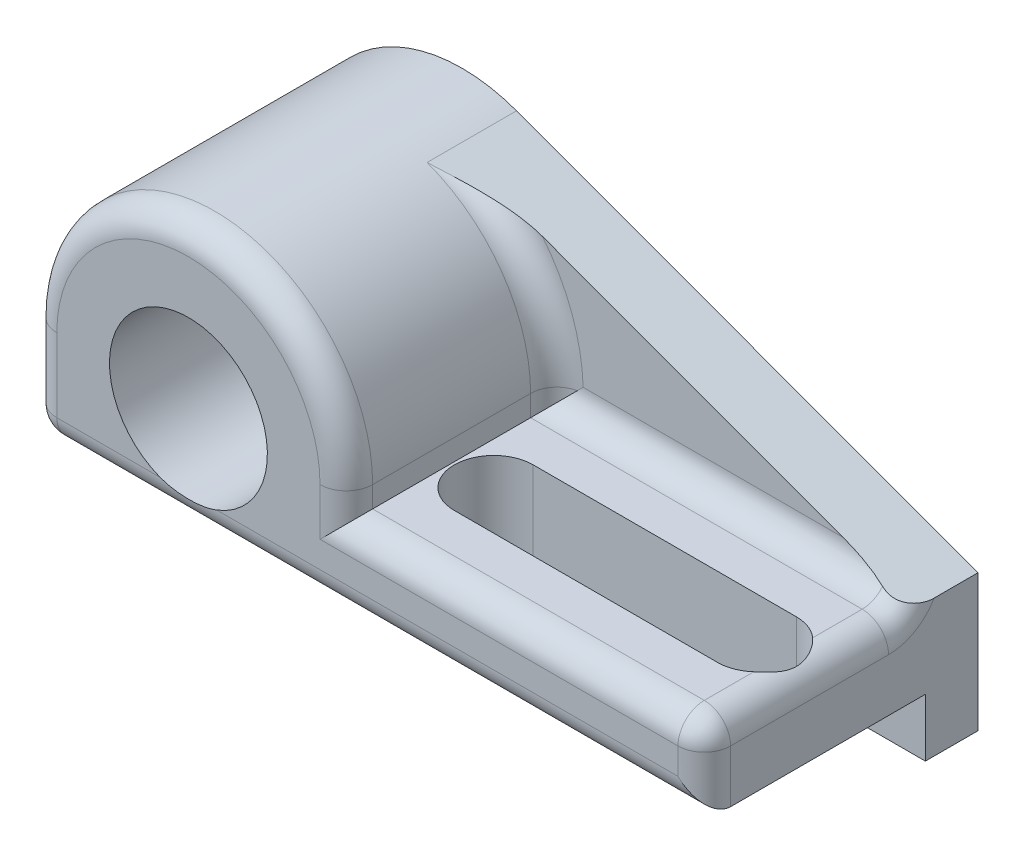
ISO-10303-21;
HEADER;
FILE_DESCRIPTION(('STEP AP214'),'2;1');
FILE_NAME('part.step','',(''),(''),'','','');
FILE_SCHEMA(('AUTOMOTIVE_DESIGN { 1 0 10303 214 1 1 1 1 }'));
ENDSEC;
DATA;
#1=APPLICATION_CONTEXT('core data for automotive mechanical design processes');
#2=APPLICATION_PROTOCOL_DEFINITION('international standard','automotive_design',2000,#1);
#3=PRODUCT_CONTEXT('',#1,'mechanical');
#4=PRODUCT('Part','Part','',(#3));
#5=PRODUCT_RELATED_PRODUCT_CATEGORY('part','',(#4));
#6=PRODUCT_DEFINITION_FORMATION('','',#4);
#7=PRODUCT_DEFINITION_CONTEXT('part definition',#1,'design');
#8=PRODUCT_DEFINITION('design','',#6,#7);
#9=PRODUCT_DEFINITION_SHAPE('','',#8);
#10=(LENGTH_UNIT() NAMED_UNIT(*) SI_UNIT(.MILLI.,.METRE.));
#11=(NAMED_UNIT(*) PLANE_ANGLE_UNIT() SI_UNIT($,.RADIAN.));
#12=(NAMED_UNIT(*) SI_UNIT($,.STERADIAN.) SOLID_ANGLE_UNIT());
#13=UNCERTAINTY_MEASURE_WITH_UNIT(LENGTH_MEASURE(1.E-05),#10,'distance_accuracy_value','');
#14=(GEOMETRIC_REPRESENTATION_CONTEXT(3) GLOBAL_UNCERTAINTY_ASSIGNED_CONTEXT((#13)) GLOBAL_UNIT_ASSIGNED_CONTEXT((#10,
#11,#12)) REPRESENTATION_CONTEXT('',''));
#15=CARTESIAN_POINT('',(0.,0.,0.));
#16=DIRECTION('',(0.,0.,1.));
#17=DIRECTION('',(1.,0.,0.));
#18=AXIS2_PLACEMENT_3D('',#15,#16,#17);
#19=CARTESIAN_POINT('',(-64.,0.,52.));
#20=DIRECTION('',(-1.,0.,0.));
#21=DIRECTION('',(0.,0.,1.));
#22=AXIS2_PLACEMENT_3D('',#19,#20,#21);
#23=PLANE('',#22);
#24=DIRECTION('',(0.,-1.,0.));
#25=VECTOR('',#24,1.);
#26=CARTESIAN_POINT('',(-64.,0.,10.));
#27=LINE('',#26,#25);
#28=CARTESIAN_POINT('',(-64.,16.,10.));
#29=VERTEX_POINT('',#28);
#30=CARTESIAN_POINT('',(-64.,0.,10.));
#31=VERTEX_POINT('',#30);
#32=EDGE_CURVE('E255',#29,#31,#27,.T.);
#33=ORIENTED_EDGE('',*,*,#32,.F.);
#34=DIRECTION('',(0.,0.,-1.));
#35=VECTOR('',#34,1.);
#36=CARTESIAN_POINT('',(-64.,16.,52.));
#37=LINE('',#36,#35);
#38=CARTESIAN_POINT('',(-64.,16.,47.));
#39=VERTEX_POINT('',#38);
#40=EDGE_CURVE('E536',#29,#39,#37,.F.);
#41=ORIENTED_EDGE('',*,*,#40,.T.);
#42=DIRECTION('',(0.,1.,0.));
#43=VECTOR('',#42,1.);
#44=CARTESIAN_POINT('',(-64.,0.,47.));
#45=LINE('',#44,#43);
#46=CARTESIAN_POINT('',(-64.,30.,47.));
#47=VERTEX_POINT('',#46);
#48=EDGE_CURVE('E395',#39,#47,#45,.T.);
#49=ORIENTED_EDGE('',*,*,#48,.T.);
#50=DIRECTION('',(0.,0.,-1.));
#51=VECTOR('',#50,1.);
#52=CARTESIAN_POINT('',(-64.,30.,52.));
#53=LINE('',#52,#51);
#54=CARTESIAN_POINT('',(-64.,30.,0.));
#55=VERTEX_POINT('',#54);
#56=EDGE_CURVE('E322',#47,#55,#53,.T.);
#57=ORIENTED_EDGE('',*,*,#56,.T.);
#58=DIRECTION('',(0.,1.,0.));
#59=VECTOR('',#58,1.);
#60=CARTESIAN_POINT('',(-64.,0.,0.));
#61=LINE('',#60,#59);
#62=CARTESIAN_POINT('',(-64.,0.,0.));
#63=VERTEX_POINT('',#62);
#64=EDGE_CURVE('E299',#63,#55,#61,.T.);
#65=ORIENTED_EDGE('',*,*,#64,.F.);
#66=DIRECTION('',(0.,0.,-1.));
#67=VECTOR('',#66,1.);
#68=CARTESIAN_POINT('',(-64.,0.,52.));
#69=LINE('',#68,#67);
#70=EDGE_CURVE('E319',#31,#63,#69,.T.);
#71=ORIENTED_EDGE('',*,*,#70,.F.);
#72=EDGE_LOOP('',(#33,#41,#49,#57,#65,#71));
#73=FACE_BOUND('',#72,.T.);
#74=ADVANCED_FACE('F49',(#73),#23,.T.);
#75=CARTESIAN_POINT('',(0.,0.,52.));
#76=DIRECTION('',(0.,-1.,0.));
#77=DIRECTION('',(1.,0.,0.));
#78=AXIS2_PLACEMENT_3D('',#75,#76,#77);
#79=PLANE('',#78);
#80=DIRECTION('',(0.,0.,-1.));
#81=VECTOR('',#80,1.);
#82=CARTESIAN_POINT('',(64.,0.,52.));
#83=LINE('',#82,#81);
#84=CARTESIAN_POINT('',(64.,0.,10.));
#85=VERTEX_POINT('',#84);
#86=CARTESIAN_POINT('',(64.,0.,0.));
#87=VERTEX_POINT('',#86);
#88=EDGE_CURVE('E316',#85,#87,#83,.T.);
#89=ORIENTED_EDGE('',*,*,#88,.F.);
#90=DIRECTION('',(1.,0.,0.));
#91=VECTOR('',#90,1.);
#92=CARTESIAN_POINT('',(-64.,0.,10.));
#93=LINE('',#92,#91);
#94=EDGE_CURVE('E266',#31,#85,#93,.T.);
#95=ORIENTED_EDGE('',*,*,#94,.F.);
#96=ORIENTED_EDGE('',*,*,#70,.T.);
#97=DIRECTION('',(-1.,0.,0.));
#98=VECTOR('',#97,1.);
#99=CARTESIAN_POINT('',(0.,0.,0.));
#100=LINE('',#99,#98);
#101=EDGE_CURVE('E303',#87,#63,#100,.T.);
#102=ORIENTED_EDGE('',*,*,#101,.F.);
#103=EDGE_LOOP('',(#89,#95,#96,#102));
#104=FACE_BOUND('',#103,.T.);
#105=ADVANCED_FACE('F479',(#104),#79,.T.);
#106=CARTESIAN_POINT('',(64.,0.,52.));
#107=DIRECTION('',(1.,0.,0.));
#108=DIRECTION('',(0.,0.,-1.));
#109=AXIS2_PLACEMENT_3D('',#106,#107,#108);
#110=PLANE('',#109);
#111=DIRECTION('',(0.,0.,-1.));
#112=VECTOR('',#111,1.);
#113=CARTESIAN_POINT('',(64.,26.,12.));
#114=LINE('',#113,#112);
#115=CARTESIAN_POINT('',(64.,26.,8.33974596215561));
#116=VERTEX_POINT('',#115);
#117=CARTESIAN_POINT('',(64.,26.,0.));
#118=VERTEX_POINT('',#117);
#119=EDGE_CURVE('E276',#116,#118,#114,.T.);
#120=ORIENTED_EDGE('',*,*,#119,.F.);
#121=CARTESIAN_POINT('',(64.,31.,17.));
#122=DIRECTION('',(1.,0.,0.));
#123=DIRECTION('',(0.,0.,-1.));
#124=AXIS2_PLACEMENT_3D('',#121,#122,#123);
#125=CIRCLE('',#124,10.);
#126=CARTESIAN_POINT('',(64.,21.,17.));
#127=VERTEX_POINT('',#126);
#128=EDGE_CURVE('E578',#116,#127,#125,.F.);
#129=ORIENTED_EDGE('',*,*,#128,.T.);
#130=DIRECTION('',(0.,0.,-1.));
#131=VECTOR('',#130,1.);
#132=CARTESIAN_POINT('',(64.,21.,52.));
#133=LINE('',#132,#131);
#134=CARTESIAN_POINT('',(64.,21.,47.));
#135=VERTEX_POINT('',#134);
#136=EDGE_CURVE('E584',#127,#135,#133,.F.);
#137=ORIENTED_EDGE('',*,*,#136,.T.);
#138=DIRECTION('',(0.,-1.,0.));
#139=VECTOR('',#138,1.);
#140=CARTESIAN_POINT('',(64.,0.,47.));
#141=LINE('',#140,#139);
#142=CARTESIAN_POINT('',(64.,11.,47.));
#143=VERTEX_POINT('',#142);
#144=EDGE_CURVE('E565',#135,#143,#141,.T.);
#145=ORIENTED_EDGE('',*,*,#144,.T.);
#146=DIRECTION('',(0.,0.,-1.));
#147=VECTOR('',#146,1.);
#148=CARTESIAN_POINT('',(64.,11.,0.));
#149=LINE('',#148,#147);
#150=CARTESIAN_POINT('',(64.,11.,10.));
#151=VERTEX_POINT('',#150);
#152=EDGE_CURVE('E259',#143,#151,#149,.T.);
#153=ORIENTED_EDGE('',*,*,#152,.T.);
#154=DIRECTION('',(0.,-1.,0.));
#155=VECTOR('',#154,1.);
#156=CARTESIAN_POINT('',(64.,0.,10.));
#157=LINE('',#156,#155);
#158=EDGE_CURVE('E250',#151,#85,#157,.T.);
#159=ORIENTED_EDGE('',*,*,#158,.T.);
#160=ORIENTED_EDGE('',*,*,#88,.T.);
#161=DIRECTION('',(0.,-1.,0.));
#162=VECTOR('',#161,1.);
#163=CARTESIAN_POINT('',(64.,0.,0.));
#164=LINE('',#163,#162);
#165=EDGE_CURVE('E291',#118,#87,#164,.T.);
#166=ORIENTED_EDGE('',*,*,#165,.F.);
#167=EDGE_LOOP('',(#120,#129,#137,#145,#153,#159,#160,#166));
#168=FACE_BOUND('',#167,.T.);
#169=ADVANCED_FACE('F485',(#168),#110,.T.);
#170=CARTESIAN_POINT('',(0.,0.,52.));
#171=DIRECTION('',(0.,0.,1.));
#172=DIRECTION('',(1.,0.,0.));
#173=AXIS2_PLACEMENT_3D('',#170,#171,#172);
#174=PLANE('',#173);
#175=DIRECTION('',(0.,1.,0.));
#176=VECTOR('',#175,1.);
#177=CARTESIAN_POINT('',(-59.,0.,52.));
#178=LINE('',#177,#176);
#179=CARTESIAN_POINT('',(-59.,30.,52.));
#180=VERTEX_POINT('',#179);
#181=CARTESIAN_POINT('',(-59.,16.,52.));
#182=VERTEX_POINT('',#181);
#183=EDGE_CURVE('E404',#180,#182,#178,.F.);
#184=ORIENTED_EDGE('',*,*,#183,.T.);
#185=DIRECTION('',(1.,0.,0.));
#186=VECTOR('',#185,1.);
#187=CARTESIAN_POINT('',(0.,16.,52.));
#188=LINE('',#187,#186);
#189=CARTESIAN_POINT('',(-39.3851648071345,16.,52.));
#190=VERTEX_POINT('',#189);
#191=EDGE_CURVE('E506',#182,#190,#188,.T.);
#192=ORIENTED_EDGE('',*,*,#191,.T.);
#193=CARTESIAN_POINT('',(-34.,30.,52.));
#194=DIRECTION('',(0.,0.,1.));
#195=DIRECTION('',(1.,0.,0.));
#196=AXIS2_PLACEMENT_3D('',#193,#194,#195);
#197=CIRCLE('',#196,15.);
#198=CARTESIAN_POINT('',(-28.6148351928655,16.,52.));
#199=VERTEX_POINT('',#198);
#200=EDGE_CURVE('E287',#199,#190,#197,.T.);
#201=ORIENTED_EDGE('',*,*,#200,.F.);
#202=DIRECTION('',(1.,0.,0.));
#203=VECTOR('',#202,1.);
#204=CARTESIAN_POINT('',(0.,16.,52.));
#205=LINE('',#204,#203);
#206=CARTESIAN_POINT('',(59.,16.,52.));
#207=VERTEX_POINT('',#206);
#208=EDGE_CURVE('E67',#199,#207,#205,.T.);
#209=ORIENTED_EDGE('',*,*,#208,.T.);
#210=DIRECTION('',(0.,-1.,0.));
#211=VECTOR('',#210,1.);
#212=CARTESIAN_POINT('',(59.,0.,52.));
#213=LINE('',#212,#211);
#214=CARTESIAN_POINT('',(59.,21.,52.));
#215=VERTEX_POINT('',#214);
#216=EDGE_CURVE('E541',#207,#215,#213,.F.);
#217=ORIENTED_EDGE('',*,*,#216,.T.);
#218=DIRECTION('',(1.,0.,0.));
#219=VECTOR('',#218,1.);
#220=CARTESIAN_POINT('',(0.,21.,52.));
#221=LINE('',#220,#219);
#222=CARTESIAN_POINT('',(-9.,21.,52.));
#223=VERTEX_POINT('',#222);
#224=EDGE_CURVE('E408',#215,#223,#221,.F.);
#225=ORIENTED_EDGE('',*,*,#224,.T.);
#226=DIRECTION('',(0.,-1.,0.));
#227=VECTOR('',#226,1.);
#228=CARTESIAN_POINT('',(-9.,0.,52.));
#229=LINE('',#228,#227);
#230=CARTESIAN_POINT('',(-9.,30.,52.));
#231=VERTEX_POINT('',#230);
#232=EDGE_CURVE('E401',#223,#231,#229,.F.);
#233=ORIENTED_EDGE('',*,*,#232,.T.);
#234=CARTESIAN_POINT('',(-34.,30.,52.));
#235=DIRECTION('',(0.,0.,1.));
#236=DIRECTION('',(1.,0.,0.));
#237=AXIS2_PLACEMENT_3D('',#234,#235,#236);
#238=CIRCLE('',#237,25.);
#239=EDGE_CURVE('E398',#231,#180,#238,.T.);
#240=ORIENTED_EDGE('',*,*,#239,.T.);
#241=EDGE_LOOP('',(#184,#192,#201,#209,#217,#225,#233,#240));
#242=FACE_BOUND('',#241,.T.);
#243=ADVANCED_FACE('F492',(#242),#174,.T.);
#244=CARTESIAN_POINT('',(-34.,30.,52.));
#245=DIRECTION('',(0.,0.,-1.));
#246=DIRECTION('',(-1.,0.,0.));
#247=AXIS2_PLACEMENT_3D('',#244,#245,#246);
#248=CYLINDRICAL_SURFACE('',#247,30.);
#249=ORIENTED_EDGE('',*,*,#56,.F.);
#250=CARTESIAN_POINT('',(-34.,30.,47.));
#251=DIRECTION('',(0.,0.,1.));
#252=DIRECTION('',(1.,0.,0.));
#253=AXIS2_PLACEMENT_3D('',#250,#251,#252);
#254=CIRCLE('',#253,30.);
#255=CARTESIAN_POINT('',(-4.,30.,47.));
#256=VERTEX_POINT('',#255);
#257=EDGE_CURVE('E417',#47,#256,#254,.F.);
#258=ORIENTED_EDGE('',*,*,#257,.T.);
#259=DIRECTION('',(0.,0.,-1.));
#260=VECTOR('',#259,1.);
#261=CARTESIAN_POINT('',(-4.,30.,52.));
#262=LINE('',#261,#260);
#263=CARTESIAN_POINT('',(-4.,30.,17.));
#264=VERTEX_POINT('',#263);
#265=EDGE_CURVE('E290',#256,#264,#262,.T.);
#266=ORIENTED_EDGE('',*,*,#265,.T.);
#267=CARTESIAN_POINT('',(-34.,30.,17.));
#268=DIRECTION('',(0.,0.,1.));
#269=DIRECTION('',(1.,0.,0.));
#270=AXIS2_PLACEMENT_3D('',#267,#268,#269);
#271=CIRCLE('',#270,30.);
#272=CARTESIAN_POINT('',(-23.6667658182192,58.1642374536304,17.));
#273=VERTEX_POINT('',#272);
#274=EDGE_CURVE('E347',#264,#273,#271,.T.);
#275=ORIENTED_EDGE('',*,*,#274,.T.);
#276=DIRECTION('',(0.,0.,-1.));
#277=VECTOR('',#276,1.);
#278=CARTESIAN_POINT('',(-23.6667658182192,58.1642374536304,12.));
#279=LINE('',#278,#277);
#280=CARTESIAN_POINT('',(-23.6667658182192,58.1642374536304,0.));
#281=VERTEX_POINT('',#280);
#282=EDGE_CURVE('E282',#273,#281,#279,.T.);
#283=ORIENTED_EDGE('',*,*,#282,.T.);
#284=CARTESIAN_POINT('',(-34.,30.,0.));
#285=DIRECTION('',(0.,0.,1.));
#286=DIRECTION('',(1.,0.,0.));
#287=AXIS2_PLACEMENT_3D('',#284,#285,#286);
#288=CIRCLE('',#287,30.);
#289=EDGE_CURVE('E295',#55,#281,#288,.F.);
#290=ORIENTED_EDGE('',*,*,#289,.F.);
#291=EDGE_LOOP('',(#249,#258,#266,#275,#283,#290));
#292=FACE_BOUND('',#291,.T.);
#293=ADVANCED_FACE('F490',(#292),#248,.T.);
#294=CARTESIAN_POINT('',(0.,26.,52.));
#295=DIRECTION('',(0.,1.,0.));
#296=DIRECTION('',(0.,0.,1.));
#297=AXIS2_PLACEMENT_3D('',#294,#295,#296);
#298=PLANE('',#297);
#299=DIRECTION('',(1.,0.,0.));
#300=VECTOR('',#299,1.);
#301=CARTESIAN_POINT('',(0.,26.,47.));
#302=LINE('',#301,#300);
#303=CARTESIAN_POINT('',(-4.,26.,47.));
#304=VERTEX_POINT('',#303);
#305=CARTESIAN_POINT('',(59.,26.,47.));
#306=VERTEX_POINT('',#305);
#307=EDGE_CURVE('E414',#304,#306,#302,.T.);
#308=ORIENTED_EDGE('',*,*,#307,.T.);
#309=DIRECTION('',(0.,0.,-1.));
#310=VECTOR('',#309,1.);
#311=CARTESIAN_POINT('',(59.,26.,52.));
#312=LINE('',#311,#310);
#313=CARTESIAN_POINT('',(59.,26.,37.5901699437495));
#314=VERTEX_POINT('',#313);
#315=EDGE_CURVE('E435',#306,#314,#312,.T.);
#316=ORIENTED_EDGE('',*,*,#315,.T.);
#317=CARTESIAN_POINT('',(54.,26.,32.));
#318=DIRECTION('',(0.,1.,0.));
#319=DIRECTION('',(0.,0.,1.));
#320=AXIS2_PLACEMENT_3D('',#317,#318,#319);
#321=CIRCLE('',#320,7.5);
#322=CARTESIAN_POINT('',(54.,26.,39.5));
#323=VERTEX_POINT('',#322);
#324=EDGE_CURVE('E233',#323,#314,#321,.T.);
#325=ORIENTED_EDGE('',*,*,#324,.F.);
#326=DIRECTION('',(1.,0.,0.));
#327=VECTOR('',#326,1.);
#328=CARTESIAN_POINT('',(54.,26.,39.5));
#329=LINE('',#328,#327);
#330=CARTESIAN_POINT('',(4.,26.,39.5));
#331=VERTEX_POINT('',#330);
#332=EDGE_CURVE('E239',#331,#323,#329,.T.);
#333=ORIENTED_EDGE('',*,*,#332,.F.);
#334=CARTESIAN_POINT('',(4.,26.,32.));
#335=DIRECTION('',(0.,1.,0.));
#336=DIRECTION('',(0.,0.,1.));
#337=AXIS2_PLACEMENT_3D('',#334,#335,#336);
#338=CIRCLE('',#337,7.49999999999999);
#339=CARTESIAN_POINT('',(4.,26.,24.5));
#340=VERTEX_POINT('',#339);
#341=EDGE_CURVE('E215',#340,#331,#338,.T.);
#342=ORIENTED_EDGE('',*,*,#341,.F.);
#343=DIRECTION('',(-1.,0.,0.));
#344=VECTOR('',#343,1.);
#345=CARTESIAN_POINT('',(54.,26.,24.5));
#346=LINE('',#345,#344);
#347=CARTESIAN_POINT('',(54.,26.,24.5));
#348=VERTEX_POINT('',#347);
#349=EDGE_CURVE('E227',#348,#340,#346,.T.);
#350=ORIENTED_EDGE('',*,*,#349,.F.);
#351=CARTESIAN_POINT('',(59.,26.,26.4098300562505));
#352=VERTEX_POINT('',#351);
#353=EDGE_CURVE('E394',#352,#348,#321,.T.);
#354=ORIENTED_EDGE('',*,*,#353,.F.);
#355=DIRECTION('',(0.,0.,-1.));
#356=VECTOR('',#355,1.);
#357=CARTESIAN_POINT('',(59.,26.,52.));
#358=LINE('',#357,#356);
#359=CARTESIAN_POINT('',(59.,26.,17.));
#360=VERTEX_POINT('',#359);
#361=EDGE_CURVE('E420',#352,#360,#358,.T.);
#362=ORIENTED_EDGE('',*,*,#361,.T.);
#363=DIRECTION('',(1.,0.,0.));
#364=VECTOR('',#363,1.);
#365=CARTESIAN_POINT('',(-4.,26.,17.));
#366=LINE('',#365,#364);
#367=CARTESIAN_POINT('',(-4.,26.,17.));
#368=VERTEX_POINT('',#367);
#369=EDGE_CURVE('E351',#360,#368,#366,.F.);
#370=ORIENTED_EDGE('',*,*,#369,.T.);
#371=DIRECTION('',(0.,0.,-1.));
#372=VECTOR('',#371,1.);
#373=CARTESIAN_POINT('',(-4.,26.,52.));
#374=LINE('',#373,#372);
#375=EDGE_CURVE('E312',#304,#368,#374,.T.);
#376=ORIENTED_EDGE('',*,*,#375,.F.);
#377=EDGE_LOOP('',(#308,#316,#325,#333,#342,#350,#354,#362,#370,#376));
#378=FACE_BOUND('',#377,.T.);
#379=ADVANCED_FACE('F236',(#378),#298,.T.);
#380=CARTESIAN_POINT('',(-34.,30.,52.));
#381=DIRECTION('',(0.,0.,-1.));
#382=DIRECTION('',(-1.,0.,0.));
#383=AXIS2_PLACEMENT_3D('',#380,#381,#382);
#384=CYLINDRICAL_SURFACE('',#383,15.);
#385=ORIENTED_EDGE('',*,*,#200,.T.);
#386=CARTESIAN_POINT('',(-39.3851648071345,16.,52.));
#387=CARTESIAN_POINT('',(-39.1915402228512,15.9255186774596,51.9999813530621));
#388=CARTESIAN_POINT('',(-38.9963822144587,15.8550641514918,51.998335596724));
#389=CARTESIAN_POINT('',(-38.603355910423,15.7223211212013,51.9927302516457));
#390=CARTESIAN_POINT('',(-38.4054878218898,15.6600319966649,51.9887708387672));
#391=CARTESIAN_POINT('',(-38.0073523571813,15.5437161617856,51.9794779042865));
#392=CARTESIAN_POINT('',(-37.8070847891205,15.4896901170582,51.9741442720798));
#393=CARTESIAN_POINT('',(-37.4045076146608,15.3899916325815,51.9629019197222));
#394=CARTESIAN_POINT('',(-37.2021979697066,15.3443193508668,51.956993188695));
#395=CARTESIAN_POINT('',(-36.5925349447613,15.219919559186,51.9394937369881));
#396=CARTESIAN_POINT('',(-36.1825157740657,15.1538290490737,51.9281318573474));
#397=CARTESIAN_POINT('',(-35.3584018629318,15.0558721562025,51.9103045137616));
#398=CARTESIAN_POINT('',(-34.9443076699632,15.0240012377951,51.9038384009387));
#399=CARTESIAN_POINT('',(-34.1096030469067,14.9945161650211,51.8978822247853));
#400=CARTESIAN_POINT('',(-33.6889762471424,14.9973386459124,51.8984810740626));
#401=CARTESIAN_POINT('',(-32.8494241725829,15.0382870626138,51.906682547324));
#402=CARTESIAN_POINT('',(-32.4304993134805,15.0764211570091,51.9142867898697));
#403=CARTESIAN_POINT('',(-31.5984492583084,15.1875610979737,51.9338725562582));
#404=CARTESIAN_POINT('',(-31.1853126670768,15.2604840565394,51.9458436597375));
#405=CARTESIAN_POINT('',(-30.3667717334592,15.4406356819758,51.9694430281091));
#406=CARTESIAN_POINT('',(-29.9613627638145,15.5478430890322,51.9810715005996));
#407=CARTESIAN_POINT('',(-29.4016259422392,15.7212433787096,51.9924658293484));
#408=CARTESIAN_POINT('',(-29.2428911115322,15.7733407598741,51.9951603765229));
#409=CARTESIAN_POINT('',(-28.9273914673688,15.8827594471646,51.9989245210198));
#410=CARTESIAN_POINT('',(-28.7706248428456,15.9400754779637,51.9999957403861));
#411=CARTESIAN_POINT('',(-28.6148351928655,16.,52.));
#412=B_SPLINE_CURVE_WITH_KNOTS('',3,(#386,#387,#388,#389,#390,#391,#392,#393,#394,#395,#396,
#397,#398,#399,#400,#401,#402,#403,#404,#405,#406,#407,#408,#409,#410,#411),.UNSPECIFIED.,.F.,
.F.,(4,2,2,2,2,2,2,2,2,2,2,2,4),(0.,0.622295487824963,1.24454368096047,1.86684197165627,
2.48915203363888,3.73398505269414,4.97865305451689,6.23900175032903,7.49964171656165,
8.75729296786865,10.0141658559224,10.5153462205142,11.0160254701711),.UNSPECIFIED.);
#413=EDGE_CURVE('E59',#190,#199,#412,.T.);
#414=ORIENTED_EDGE('',*,*,#413,.T.);
#415=EDGE_LOOP('',(#385,#414));
#416=FACE_BOUND('',#415,.T.);
#417=CARTESIAN_POINT('',(-34.,30.,0.));
#418=DIRECTION('',(0.,0.,1.));
#419=DIRECTION('',(1.,0.,0.));
#420=AXIS2_PLACEMENT_3D('',#417,#418,#419);
#421=CIRCLE('',#420,15.);
#422=CARTESIAN_POINT('',(-19.,30.,0.));
#423=VERTEX_POINT('',#422);
#424=EDGE_CURVE('E286',#423,#423,#421,.T.);
#425=ORIENTED_EDGE('',*,*,#424,.F.);
#426=EDGE_LOOP('',(#425));
#427=FACE_BOUND('',#426,.T.);
#428=ADVANCED_FACE('F494',(#416,#427),#384,.F.);
#429=CARTESIAN_POINT('',(-4.,0.,52.));
#430=DIRECTION('',(1.,0.,0.));
#431=DIRECTION('',(0.,1.,0.));
#432=AXIS2_PLACEMENT_3D('',#429,#430,#431);
#433=PLANE('',#432);
#434=ORIENTED_EDGE('',*,*,#265,.F.);
#435=DIRECTION('',(0.,-1.,0.));
#436=VECTOR('',#435,1.);
#437=CARTESIAN_POINT('',(-4.,0.,47.));
#438=LINE('',#437,#436);
#439=EDGE_CURVE('E411',#256,#304,#438,.T.);
#440=ORIENTED_EDGE('',*,*,#439,.T.);
#441=ORIENTED_EDGE('',*,*,#375,.T.);
#442=DIRECTION('',(0.,-1.,0.));
#443=VECTOR('',#442,1.);
#444=CARTESIAN_POINT('',(-4.00000000000001,58.1642374536304,17.));
#445=LINE('',#444,#443);
#446=EDGE_CURVE('E343',#368,#264,#445,.F.);
#447=ORIENTED_EDGE('',*,*,#446,.T.);
#448=EDGE_LOOP('',(#434,#440,#441,#447));
#449=FACE_BOUND('',#448,.T.);
#450=ADVANCED_FACE('F497',(#449),#433,.T.);
#451=CARTESIAN_POINT('',(0.,0.,0.));
#452=DIRECTION('',(0.,0.,1.));
#453=DIRECTION('',(1.,0.,0.));
#454=AXIS2_PLACEMENT_3D('',#451,#452,#453);
#455=PLANE('',#454);
#456=ORIENTED_EDGE('',*,*,#424,.T.);
#457=EDGE_LOOP('',(#456));
#458=FACE_BOUND('',#457,.T.);
#459=ORIENTED_EDGE('',*,*,#289,.T.);
#460=DIRECTION('',(0.938807915121013,-0.344441139392695,0.));
#461=VECTOR('',#460,1.);
#462=CARTESIAN_POINT('',(16.000406471227,43.6106681879708,0.));
#463=LINE('',#462,#461);
#464=EDGE_CURVE('E269',#281,#118,#463,.T.);
#465=ORIENTED_EDGE('',*,*,#464,.T.);
#466=ORIENTED_EDGE('',*,*,#165,.T.);
#467=ORIENTED_EDGE('',*,*,#101,.T.);
#468=ORIENTED_EDGE('',*,*,#64,.T.);
#469=EDGE_LOOP('',(#459,#465,#466,#467,#468));
#470=FACE_BOUND('',#469,.T.);
#471=ADVANCED_FACE('F475',(#458,#470),#455,.F.);
#472=CARTESIAN_POINT('',(16.000406471227,43.6106681879708,12.));
#473=DIRECTION('',(0.344441139392694,0.938807915121013,0.));
#474=DIRECTION('',(-0.938807915121013,0.344441139392694,0.));
#475=AXIS2_PLACEMENT_3D('',#472,#473,#474);
#476=PLANE('',#475);
#477=CARTESIAN_POINT('',(50.3720124028117,31.,17.));
#478=DIRECTION('',(0.344441139392694,0.938807915121013,0.));
#479=DIRECTION('',(-0.938807915121013,0.344441139392694,0.));
#480=AXIS2_PLACEMENT_3D('',#477,#478,#479);
#481=ELLIPSE('',#480,14.5162683203749,5.);
#482=CARTESIAN_POINT('',(50.3720124028117,31.,12.));
#483=VERTEX_POINT('',#482);
#484=CARTESIAN_POINT('',(59.,27.8344601373983,13.1296825222885));
#485=VERTEX_POINT('',#484);
#486=EDGE_CURVE('E363',#483,#485,#481,.F.);
#487=ORIENTED_EDGE('',*,*,#486,.T.);
#488=CARTESIAN_POINT('',(59.,27.8344601373983,13.1296825222885));
#489=CARTESIAN_POINT('',(59.1025173276589,27.7968473472017,13.1604058061602));
#490=CARTESIAN_POINT('',(59.2057599867482,27.758968438686,13.1882629573618));
#491=CARTESIAN_POINT('',(59.4138380582681,27.6826262531521,13.2373090481556));
#492=CARTESIAN_POINT('',(59.5186762286784,27.644161964253,13.2584846234498));
#493=CARTESIAN_POINT('',(59.8370456672262,27.5273547554566,13.3107160357347));
#494=CARTESIAN_POINT('',(60.052614234816,27.4482643666327,13.329896021747));
#495=CARTESIAN_POINT('',(60.358013178901,27.3362159288472,13.3281221099141));
#496=CARTESIAN_POINT('',(60.4480551884299,27.3031802334128,13.32402225391));
#497=CARTESIAN_POINT('',(60.6275712146382,27.2373172345921,13.3081279994209));
#498=CARTESIAN_POINT('',(60.7170452252539,27.2044899334306,13.2963335189289));
#499=CARTESIAN_POINT('',(60.8943092631088,27.1394531711828,13.2647443243429));
#500=CARTESIAN_POINT('',(60.9821052594333,27.1072415200867,13.2449877698653));
#501=CARTESIAN_POINT('',(61.1557406892644,27.0435360651937,13.1973663508489));
#502=CARTESIAN_POINT('',(61.2415801528377,27.0120422503655,13.1695016110013));
#503=CARTESIAN_POINT('',(61.4108313777958,26.9499453252872,13.1057438176859));
#504=CARTESIAN_POINT('',(61.4942366106609,26.9193446102989,13.0698310810506));
#505=CARTESIAN_POINT('',(61.6577902456637,26.8593380855511,12.9904452069197));
#506=CARTESIAN_POINT('',(61.7379386055818,26.8299322912816,12.9469719714538));
#507=CARTESIAN_POINT('',(61.9731579396874,26.7436321928891,12.8058246091473));
#508=CARTESIAN_POINT('',(62.1227030696798,26.6887652769465,12.6975380866813));
#509=CARTESIAN_POINT('',(62.4409569017324,26.5720004832516,12.42759004146));
#510=CARTESIAN_POINT('',(62.604701764275,26.511923798644,12.2593638223358));
#511=CARTESIAN_POINT('',(62.9044923625603,26.4019330182197,11.8970359437123));
#512=CARTESIAN_POINT('',(63.0405028723173,26.3520318465364,11.7029018892738));
#513=CARTESIAN_POINT('',(63.3197765688295,26.2495685538013,11.2385487487555));
#514=CARTESIAN_POINT('',(63.4542319820382,26.2002379346436,10.962329798048));
#515=CARTESIAN_POINT('',(63.6791254643002,26.1177263089695,10.3902582346681));
#516=CARTESIAN_POINT('',(63.7695211354996,26.0845608578878,10.0943870207838));
#517=CARTESIAN_POINT('',(63.8922507959704,26.0395323239258,9.55486367204035));
#518=CARTESIAN_POINT('',(63.9327858955222,26.0246603190671,9.31327415761585));
#519=CARTESIAN_POINT('',(63.9866007982135,26.0049160603101,8.82769527663971));
#520=CARTESIAN_POINT('',(63.9999944774364,26.0000020261846,8.58372027067383));
#521=CARTESIAN_POINT('',(64.,26.,8.33974596215561));
#522=B_SPLINE_CURVE_WITH_KNOTS('',3,(#488,#489,#490,#491,#492,#493,#494,#495,#496,#497,#498,
#499,#500,#501,#502,#503,#504,#505,#506,#507,#508,#509,#510,#511,#512,#513,#514,#515,#516,#517,
#518,#519,#520,#521),.UNSPECIFIED.,.F.,.F.,(4,2,2,2,2,2,2,2,2,2,2,2,2,2,2,2,4),(0.,
0.340182601193696,0.681041374893807,1.36878359138038,1.65653611398122,1.94429170341659,
2.230684270836,2.51707243421757,2.80416881959464,3.09126892548808,3.66647501449765,
4.38962435597846,5.11368654088114,6.0423188277095,6.97184296415952,7.70641622462096,
8.43790103289748),.UNSPECIFIED.);
#523=EDGE_CURVE('E616',#485,#116,#522,.T.);
#524=ORIENTED_EDGE('',*,*,#523,.T.);
#525=ORIENTED_EDGE('',*,*,#119,.T.);
#526=ORIENTED_EDGE('',*,*,#464,.F.);
#527=ORIENTED_EDGE('',*,*,#282,.F.);
#528=CARTESIAN_POINT('',(-6.74216543931793,51.9547365063324,12.));
#529=CARTESIAN_POINT('',(-6.90685384964402,52.0151593710994,12.0000035430437));
#530=CARTESIAN_POINT('',(-7.07152929326014,52.0755774784838,12.0024489062426));
#531=CARTESIAN_POINT('',(-7.40074799767513,52.1963651964308,12.0119359986984));
#532=CARTESIAN_POINT('',(-7.56529127012688,52.2567348112688,12.0189772645216));
#533=CARTESIAN_POINT('',(-8.05840737085177,52.4376551772466,12.0465533580235));
#534=CARTESIAN_POINT('',(-8.38667293079756,52.5580931940869,12.073541208278));
#535=CARTESIAN_POINT('',(-9.04085265335599,52.7981065188324,12.142621119399));
#536=CARTESIAN_POINT('',(-9.36677079437924,52.9176832863848,12.1846715902249));
#537=CARTESIAN_POINT('',(-10.0168674457716,53.1561985648719,12.2821715502498));
#538=CARTESIAN_POINT('',(-10.3410456620152,53.2751369678943,12.3376232361932));
#539=CARTESIAN_POINT('',(-11.3042853348188,53.628541924398,12.5205535244459));
#540=CARTESIAN_POINT('',(-11.9404692973938,53.8619527482772,12.6653487134699));
#541=CARTESIAN_POINT('',(-13.2048289923743,54.3258362402321,12.9915020799276));
#542=CARTESIAN_POINT('',(-13.8329978809559,54.5563063973635,13.1728895361366));
#543=CARTESIAN_POINT('',(-15.2391212042276,55.0722018343251,13.6134272925819));
#544=CARTESIAN_POINT('',(-16.0148282944671,55.3568025813934,13.8806465962675));
#545=CARTESIAN_POINT('',(-17.5561925155169,55.9223168255389,14.4463379463335));
#546=CARTESIAN_POINT('',(-18.3218467029108,56.2032292427,14.7448189259692));
#547=CARTESIAN_POINT('',(-20.6112021861988,57.0431755175857,15.6712748672415));
#548=CARTESIAN_POINT('',(-22.1240706545786,57.5982348972609,16.3291464770031));
#549=CARTESIAN_POINT('',(-23.6466932688555,58.1568729952977,16.9912713006402));
#550=CARTESIAN_POINT('',(-23.6567295476826,58.1605552259849,16.9956356585972));
#551=CARTESIAN_POINT('',(-23.6667658182192,58.1642374536304,17.));
#552=B_SPLINE_CURVE_WITH_KNOTS('',3,(#528,#529,#530,#531,#532,#533,#534,#535,#536,#537,#538,
#539,#540,#541,#542,#543,#544,#545,#546,#547,#548,#549,#550,#551),.UNSPECIFIED.,.F.,.F.,(4,2,2,
2,2,2,2,2,2,2,2,4),(0.,0.526228685354727,1.05240431596708,2.10409662993185,3.15290717667135,
4.20188976253747,6.27927543791386,8.35832994362685,10.9625753530016,13.5675669857278,
18.7883727544024,18.8230137705546),.UNSPECIFIED.);
#553=CARTESIAN_POINT('',(-6.74216543931793,51.9547365063324,12.));
#554=VERTEX_POINT('',#553);
#555=EDGE_CURVE('E354',#273,#554,#552,.F.);
#556=ORIENTED_EDGE('',*,*,#555,.T.);
#557=DIRECTION('',(0.938807915121013,-0.344441139392695,0.));
#558=VECTOR('',#557,1.);
#559=CARTESIAN_POINT('',(16.000406471227,43.6106681879708,12.));
#560=LINE('',#559,#558);
#561=EDGE_CURVE('E272',#554,#483,#560,.T.);
#562=ORIENTED_EDGE('',*,*,#561,.T.);
#563=EDGE_LOOP('',(#487,#524,#525,#526,#527,#556,#562));
#564=FACE_BOUND('',#563,.T.);
#565=ADVANCED_FACE('F365',(#564),#476,.T.);
#566=CARTESIAN_POINT('',(0.,0.,12.));
#567=DIRECTION('',(0.,0.,1.));
#568=DIRECTION('',(1.,0.,0.));
#569=AXIS2_PLACEMENT_3D('',#566,#567,#568);
#570=PLANE('',#569);
#571=ORIENTED_EDGE('',*,*,#561,.F.);
#572=CARTESIAN_POINT('',(-34.,30.,12.));
#573=DIRECTION('',(0.,0.,1.));
#574=DIRECTION('',(1.,0.,0.));
#575=AXIS2_PLACEMENT_3D('',#572,#573,#574);
#576=CIRCLE('',#575,35.);
#577=CARTESIAN_POINT('',(0.985711369071801,31.,12.));
#578=VERTEX_POINT('',#577);
#579=EDGE_CURVE('E339',#554,#578,#576,.F.);
#580=ORIENTED_EDGE('',*,*,#579,.T.);
#581=DIRECTION('',(1.,0.,0.));
#582=VECTOR('',#581,1.);
#583=CARTESIAN_POINT('',(64.,31.,12.));
#584=LINE('',#583,#582);
#585=EDGE_CURVE('E336',#578,#483,#584,.T.);
#586=ORIENTED_EDGE('',*,*,#585,.T.);
#587=EDGE_LOOP('',(#571,#580,#586));
#588=FACE_BOUND('',#587,.T.);
#589=ADVANCED_FACE('F468',(#588),#570,.T.);
#590=CARTESIAN_POINT('',(-64.,0.,10.));
#591=DIRECTION('',(0.,0.,1.));
#592=DIRECTION('',(0.,-1.,0.));
#593=AXIS2_PLACEMENT_3D('',#590,#591,#592);
#594=PLANE('',#593);
#595=ORIENTED_EDGE('',*,*,#158,.F.);
#596=DIRECTION('',(1.,0.,0.));
#597=VECTOR('',#596,1.);
#598=CARTESIAN_POINT('',(-64.,11.,10.));
#599=LINE('',#598,#597);
#600=CARTESIAN_POINT('',(-59.,11.,10.));
#601=VERTEX_POINT('',#600);
#602=EDGE_CURVE('E258',#601,#151,#599,.T.);
#603=ORIENTED_EDGE('',*,*,#602,.F.);
#604=CARTESIAN_POINT('',(-59.,16.,10.));
#605=DIRECTION('',(0.,0.,1.));
#606=DIRECTION('',(0.,-1.,0.));
#607=AXIS2_PLACEMENT_3D('',#604,#605,#606);
#608=CIRCLE('',#607,5.);
#609=EDGE_CURVE('E11',#601,#29,#608,.F.);
#610=ORIENTED_EDGE('',*,*,#609,.T.);
#611=ORIENTED_EDGE('',*,*,#32,.T.);
#612=ORIENTED_EDGE('',*,*,#94,.T.);
#613=EDGE_LOOP('',(#595,#603,#610,#611,#612));
#614=FACE_BOUND('',#613,.T.);
#615=ADVANCED_FACE('F465',(#614),#594,.T.);
#616=CARTESIAN_POINT('',(-64.,11.,0.));
#617=DIRECTION('',(0.,-1.,0.));
#618=DIRECTION('',(0.,0.,-1.));
#619=AXIS2_PLACEMENT_3D('',#616,#617,#618);
#620=PLANE('',#619);
#621=CARTESIAN_POINT('',(54.,11.,32.));
#622=DIRECTION('',(0.,-1.,0.));
#623=DIRECTION('',(0.,0.,-1.));
#624=AXIS2_PLACEMENT_3D('',#621,#622,#623);
#625=CIRCLE('',#624,7.5);
#626=CARTESIAN_POINT('',(54.,11.,24.5));
#627=VERTEX_POINT('',#626);
#628=CARTESIAN_POINT('',(54.,11.,39.5));
#629=VERTEX_POINT('',#628);
#630=EDGE_CURVE('E333',#627,#629,#625,.T.);
#631=ORIENTED_EDGE('',*,*,#630,.F.);
#632=DIRECTION('',(1.,0.,0.));
#633=VECTOR('',#632,1.);
#634=CARTESIAN_POINT('',(-64.,11.,24.5));
#635=LINE('',#634,#633);
#636=CARTESIAN_POINT('',(4.,11.,24.5));
#637=VERTEX_POINT('',#636);
#638=EDGE_CURVE('E325',#637,#627,#635,.T.);
#639=ORIENTED_EDGE('',*,*,#638,.F.);
#640=CARTESIAN_POINT('',(4.,11.,32.));
#641=DIRECTION('',(0.,-1.,0.));
#642=DIRECTION('',(0.,0.,-1.));
#643=AXIS2_PLACEMENT_3D('',#640,#641,#642);
#644=CIRCLE('',#643,7.49999999999999);
#645=CARTESIAN_POINT('',(4.,11.,39.5));
#646=VERTEX_POINT('',#645);
#647=EDGE_CURVE('E218',#646,#637,#644,.T.);
#648=ORIENTED_EDGE('',*,*,#647,.F.);
#649=DIRECTION('',(-1.,0.,0.));
#650=VECTOR('',#649,1.);
#651=CARTESIAN_POINT('',(-64.,11.,39.5));
#652=LINE('',#651,#650);
#653=EDGE_CURVE('E330',#629,#646,#652,.T.);
#654=ORIENTED_EDGE('',*,*,#653,.F.);
#655=EDGE_LOOP('',(#631,#639,#648,#654));
#656=FACE_BOUND('',#655,.T.);
#657=DIRECTION('',(1.,0.,0.));
#658=VECTOR('',#657,1.);
#659=CARTESIAN_POINT('',(-64.,11.,47.));
#660=LINE('',#659,#658);
#661=CARTESIAN_POINT('',(-59.,11.,47.));
#662=VERTEX_POINT('',#661);
#663=EDGE_CURVE('E556',#143,#662,#660,.F.);
#664=ORIENTED_EDGE('',*,*,#663,.T.);
#665=DIRECTION('',(0.,0.,-1.));
#666=VECTOR('',#665,1.);
#667=CARTESIAN_POINT('',(-59.,11.,0.));
#668=LINE('',#667,#666);
#669=EDGE_CURVE('E543',#662,#601,#668,.T.);
#670=ORIENTED_EDGE('',*,*,#669,.T.);
#671=ORIENTED_EDGE('',*,*,#602,.T.);
#672=ORIENTED_EDGE('',*,*,#152,.F.);
#673=EDGE_LOOP('',(#664,#670,#671,#672));
#674=FACE_BOUND('',#673,.T.);
#675=ADVANCED_FACE('F460',(#656,#674),#620,.T.);
#676=CARTESIAN_POINT('',(54.,0.,32.));
#677=DIRECTION('',(0.,1.,0.));
#678=DIRECTION('',(0.,0.,1.));
#679=AXIS2_PLACEMENT_3D('',#676,#677,#678);
#680=CYLINDRICAL_SURFACE('',#679,7.5);
#681=ORIENTED_EDGE('',*,*,#324,.T.);
#682=CARTESIAN_POINT('',(59.,26.,37.5901699437495));
#683=CARTESIAN_POINT('',(59.1598266708329,25.9999821134944,37.447273883382));
#684=CARTESIAN_POINT('',(59.3132950813102,25.992342398694,37.2976210839124));
#685=CARTESIAN_POINT('',(59.6061907023417,25.9652951660564,36.9865818987181));
#686=CARTESIAN_POINT('',(59.7456418350327,25.9459081081126,36.8252163417808));
#687=CARTESIAN_POINT('',(60.009371782837,25.8988837803248,36.4924901763746));
#688=CARTESIAN_POINT('',(60.1336919017591,25.8712697134797,36.3211587545037));
#689=CARTESIAN_POINT('',(60.3671127404676,25.8109808591093,35.969190049526));
#690=CARTESIAN_POINT('',(60.4762076260488,25.7783041416767,35.7885492352313));
#691=CARTESIAN_POINT('',(60.6680786636588,25.7145135688217,35.4383602687568));
#692=CARTESIAN_POINT('',(60.7524139814119,25.6835935345375,35.2696271066117));
#693=CARTESIAN_POINT('',(60.908160730212,25.6223289228136,34.9262342985295));
#694=CARTESIAN_POINT('',(60.9795749763158,25.5919842213215,34.7515759533562));
#695=CARTESIAN_POINT('',(61.1091703077701,25.5339218708782,34.3969438649928));
#696=CARTESIAN_POINT('',(61.1673489916073,25.5062046992079,34.2169691638643));
#697=CARTESIAN_POINT('',(61.2700707300991,25.4553412735597,33.852540853312));
#698=CARTESIAN_POINT('',(61.3146147829642,25.4321946850071,33.6680875728388));
#699=CARTESIAN_POINT('',(61.3938691163523,25.3899482429978,33.2748610800562));
#700=CARTESIAN_POINT('',(61.4269279324232,25.3715879311741,33.0656703995112));
#701=CARTESIAN_POINT('',(61.4752507871577,25.3444113711898,32.6446130302059));
#702=CARTESIAN_POINT('',(61.4905148437565,25.3355951134099,32.4327463441431));
#703=CARTESIAN_POINT('',(61.5029945668098,25.3284030261376,32.0084742275778));
#704=CARTESIAN_POINT('',(61.5002252025984,25.3300185373451,31.7960693901726));
#705=CARTESIAN_POINT('',(61.4767202841965,25.3435051769129,31.3726040283252));
#706=CARTESIAN_POINT('',(61.4559856987584,25.3553757522813,31.1615434320146));
#707=CARTESIAN_POINT('',(61.4005953385696,25.386114055119,30.7689868254243));
#708=CARTESIAN_POINT('',(61.3680168413696,25.403914800977,30.5871091219752));
#709=CARTESIAN_POINT('',(61.2897127360852,25.4451278130221,30.2268331777));
#710=CARTESIAN_POINT('',(61.2439816987203,25.468542395898,30.0484364063202));
#711=CARTESIAN_POINT('',(61.0873737326835,25.5449381253629,29.5191764203168));
#712=CARTESIAN_POINT('',(60.9571419385656,25.6040319361332,29.1746629810923));
#713=CARTESIAN_POINT('',(60.7172206203391,25.6967537875992,28.6578042303341));
#714=CARTESIAN_POINT('',(60.6243282336145,25.7299695206724,28.4772772539352));
#715=CARTESIAN_POINT('',(60.4239561367547,25.7941032638655,28.1239204807585));
#716=CARTESIAN_POINT('',(60.3164724711242,25.8250206474051,27.9510927880826));
#717=CARTESIAN_POINT('',(60.0877711845035,25.8816581149894,27.6147659004987));
#718=CARTESIAN_POINT('',(59.9666020370566,25.9073956970083,27.4512366850186));
#719=CARTESIAN_POINT('',(59.7108409033496,25.9509096958379,27.1340234632091));
#720=CARTESIAN_POINT('',(59.5762604588347,25.968692887061,26.9803311751645));
#721=CARTESIAN_POINT('',(59.3658185934256,25.9870892679647,26.7589880203562));
#722=CARTESIAN_POINT('',(59.2946863033524,25.9918375163814,26.6871361705419));
#723=CARTESIAN_POINT('',(59.1494988569873,25.9982925908581,26.5462953725559));
#724=CARTESIAN_POINT('',(59.0754434298018,25.9999991343569,26.4773066909415));
#725=CARTESIAN_POINT('',(59.,26.,26.4098300562505));
#726=B_SPLINE_CURVE_WITH_KNOTS('',3,(#682,#683,#684,#685,#686,#687,#688,#689,#690,#691,#692,
#693,#694,#695,#696,#697,#698,#699,#700,#701,#702,#703,#704,#705,#706,#707,#708,#709,#710,#711,
#712,#713,#714,#715,#716,#717,#718,#719,#720,#721,#722,#723,#724,#725),.UNSPECIFIED.,.F.,.F.,(4,
2,2,2,2,2,2,2,2,2,2,2,2,2,2,2,2,2,2,2,2,4),(0.,0.642507737590302,1.28389964791852,
1.92349946603792,2.56334370540843,3.13628750857705,3.70910633631622,4.28202901584816,
4.85490974086844,5.49170190439195,6.12849342609299,6.76475642193483,7.4009851102102,
7.95724758528278,8.51374001215576,9.62798842078538,10.2446555970922,10.8614902784749,
11.4762048889375,12.0903949719445,12.3939355808346,12.6975043858603),.UNSPECIFIED.);
#727=EDGE_CURVE('E439',#314,#352,#726,.T.);
#728=ORIENTED_EDGE('',*,*,#727,.T.);
#729=ORIENTED_EDGE('',*,*,#353,.T.);
#730=DIRECTION('',(0.,1.,0.));
#731=VECTOR('',#730,1.);
#732=CARTESIAN_POINT('',(54.,0.,24.5));
#733=LINE('',#732,#731);
#734=EDGE_CURVE('E223',#627,#348,#733,.T.);
#735=ORIENTED_EDGE('',*,*,#734,.F.);
#736=ORIENTED_EDGE('',*,*,#630,.T.);
#737=DIRECTION('',(0.,1.,0.));
#738=VECTOR('',#737,1.);
#739=CARTESIAN_POINT('',(54.,0.,39.5));
#740=LINE('',#739,#738);
#741=EDGE_CURVE('E247',#629,#323,#740,.T.);
#742=ORIENTED_EDGE('',*,*,#741,.T.);
#743=EDGE_LOOP('',(#681,#728,#729,#735,#736,#742));
#744=FACE_BOUND('',#743,.T.);
#745=ADVANCED_FACE('F454',(#744),#680,.F.);
#746=CARTESIAN_POINT('',(54.,0.,39.5));
#747=DIRECTION('',(0.,0.,1.));
#748=DIRECTION('',(1.,0.,0.));
#749=AXIS2_PLACEMENT_3D('',#746,#747,#748);
#750=PLANE('',#749);
#751=ORIENTED_EDGE('',*,*,#653,.T.);
#752=DIRECTION('',(0.,1.,0.));
#753=VECTOR('',#752,1.);
#754=CARTESIAN_POINT('',(4.,0.,39.5));
#755=LINE('',#754,#753);
#756=EDGE_CURVE('E222',#646,#331,#755,.T.);
#757=ORIENTED_EDGE('',*,*,#756,.T.);
#758=ORIENTED_EDGE('',*,*,#332,.T.);
#759=ORIENTED_EDGE('',*,*,#741,.F.);
#760=EDGE_LOOP('',(#751,#757,#758,#759));
#761=FACE_BOUND('',#760,.T.);
#762=ADVANCED_FACE('F459',(#761),#750,.F.);
#763=CARTESIAN_POINT('',(4.,0.,32.));
#764=DIRECTION('',(0.,1.,0.));
#765=DIRECTION('',(0.,0.,1.));
#766=AXIS2_PLACEMENT_3D('',#763,#764,#765);
#767=CYLINDRICAL_SURFACE('',#766,7.49999999999999);
#768=ORIENTED_EDGE('',*,*,#647,.T.);
#769=DIRECTION('',(0.,1.,0.));
#770=VECTOR('',#769,1.);
#771=CARTESIAN_POINT('',(4.,0.,24.5));
#772=LINE('',#771,#770);
#773=EDGE_CURVE('E210',#637,#340,#772,.T.);
#774=ORIENTED_EDGE('',*,*,#773,.T.);
#775=ORIENTED_EDGE('',*,*,#341,.T.);
#776=ORIENTED_EDGE('',*,*,#756,.F.);
#777=EDGE_LOOP('',(#768,#774,#775,#776));
#778=FACE_BOUND('',#777,.T.);
#779=ADVANCED_FACE('F212',(#778),#767,.F.);
#780=CARTESIAN_POINT('',(54.,0.,24.5));
#781=DIRECTION('',(0.,0.,-1.));
#782=DIRECTION('',(-1.,0.,0.));
#783=AXIS2_PLACEMENT_3D('',#780,#781,#782);
#784=PLANE('',#783);
#785=ORIENTED_EDGE('',*,*,#638,.T.);
#786=ORIENTED_EDGE('',*,*,#734,.T.);
#787=ORIENTED_EDGE('',*,*,#349,.T.);
#788=ORIENTED_EDGE('',*,*,#773,.F.);
#789=EDGE_LOOP('',(#785,#786,#787,#788));
#790=FACE_BOUND('',#789,.T.);
#791=ADVANCED_FACE('F228',(#790),#784,.F.);
#792=CARTESIAN_POINT('',(0.,31.,17.));
#793=DIRECTION('',(-1.,0.,0.));
#794=DIRECTION('',(0.,0.,1.));
#795=AXIS2_PLACEMENT_3D('',#792,#793,#794);
#796=CYLINDRICAL_SURFACE('',#795,5.);
#797=ORIENTED_EDGE('',*,*,#369,.F.);
#798=CARTESIAN_POINT('',(59.,31.,17.));
#799=DIRECTION('',(1.,0.,0.));
#800=DIRECTION('',(0.,0.,-1.));
#801=AXIS2_PLACEMENT_3D('',#798,#799,#800);
#802=CIRCLE('',#801,5.);
#803=EDGE_CURVE('E448',#360,#485,#802,.T.);
#804=ORIENTED_EDGE('',*,*,#803,.T.);
#805=ORIENTED_EDGE('',*,*,#486,.F.);
#806=ORIENTED_EDGE('',*,*,#585,.F.);
#807=CARTESIAN_POINT('',(0.,30.,12.1010205144336));
#808=CARTESIAN_POINT('',(0.162876506441531,30.1628676738525,12.0677936441853));
#809=CARTESIAN_POINT('',(0.326045238123512,30.3272155962003,12.0426882029286));
#810=CARTESIAN_POINT('',(0.651632606998497,30.6574905797719,12.0089863904321));
#811=CARTESIAN_POINT('',(0.814052094229788,30.8234124973428,12.0003477582926));
#812=CARTESIAN_POINT('',(0.979139069437301,30.9932376340621,12.0000034337388));
#813=CARTESIAN_POINT('',(0.982425348864007,30.9966187112602,12.0000000039242));
#814=CARTESIAN_POINT('',(0.985711369071801,31.,12.));
#815=B_SPLINE_CURVE_WITH_KNOTS('',3,(#807,#808,#809,#810,#811,#812,#813,#814),.UNSPECIFIED.,.F.,
.F.,(4,2,2,4),(0.,0.698172553266493,1.39455087089759,1.40869589792168),.UNSPECIFIED.);
#816=CARTESIAN_POINT('',(0.,30.,12.1010205144336));
#817=VERTEX_POINT('',#816);
#818=EDGE_CURVE('E383',#817,#578,#815,.T.);
#819=ORIENTED_EDGE('',*,*,#818,.F.);
#820=CARTESIAN_POINT('',(0.999999999999996,31.,17.));
#821=DIRECTION('',(-0.707106781186548,0.707106781186547,0.));
#822=DIRECTION('',(0.707106781186547,0.707106781186548,0.));
#823=AXIS2_PLACEMENT_3D('',#820,#821,#822);
#824=ELLIPSE('',#823,7.07106781186547,5.);
#825=EDGE_CURVE('E390',#368,#817,#824,.F.);
#826=ORIENTED_EDGE('',*,*,#825,.F.);
#827=EDGE_LOOP('',(#797,#804,#805,#806,#819,#826));
#828=FACE_BOUND('',#827,.T.);
#829=ADVANCED_FACE('F377',(#828),#796,.F.);
#830=CARTESIAN_POINT('',(1.,0.,17.));
#831=DIRECTION('',(0.,1.,0.));
#832=DIRECTION('',(-1.,0.,0.));
#833=AXIS2_PLACEMENT_3D('',#830,#831,#832);
#834=CYLINDRICAL_SURFACE('',#833,5.);
#835=ORIENTED_EDGE('',*,*,#446,.F.);
#836=ORIENTED_EDGE('',*,*,#825,.T.);
#837=CARTESIAN_POINT('',(0.999999999999997,30.,17.));
#838=DIRECTION('',(0.,-1.,0.));
#839=DIRECTION('',(0.,0.,-1.));
#840=AXIS2_PLACEMENT_3D('',#837,#838,#839);
#841=CIRCLE('',#840,5.);
#842=EDGE_CURVE('E391',#264,#817,#841,.T.);
#843=ORIENTED_EDGE('',*,*,#842,.F.);
#844=EDGE_LOOP('',(#835,#836,#843));
#845=FACE_BOUND('',#844,.T.);
#846=ADVANCED_FACE('F375',(#845),#834,.F.);
#847=CARTESIAN_POINT('',(-34.,30.,17.));
#848=DIRECTION('',(0.,0.,1.));
#849=DIRECTION('',(1.,0.,0.));
#850=AXIS2_PLACEMENT_3D('',#847,#848,#849);
#851=TOROIDAL_SURFACE('',#850,35.,5.);
#852=ORIENTED_EDGE('',*,*,#555,.F.);
#853=ORIENTED_EDGE('',*,*,#274,.F.);
#854=ORIENTED_EDGE('',*,*,#842,.T.);
#855=ORIENTED_EDGE('',*,*,#818,.T.);
#856=ORIENTED_EDGE('',*,*,#579,.F.);
#857=EDGE_LOOP('',(#852,#853,#854,#855,#856));
#858=FACE_BOUND('',#857,.T.);
#859=ADVANCED_FACE('F369',(#858),#851,.F.);
#860=CARTESIAN_POINT('',(0.,21.,47.));
#861=DIRECTION('',(1.,0.,0.));
#862=DIRECTION('',(0.,0.,-1.));
#863=AXIS2_PLACEMENT_3D('',#860,#861,#862);
#864=CYLINDRICAL_SURFACE('',#863,5.);
#865=ORIENTED_EDGE('',*,*,#224,.F.);
#866=CARTESIAN_POINT('',(59.,21.,47.));
#867=DIRECTION('',(1.,0.,0.));
#868=DIRECTION('',(0.,0.,-1.));
#869=AXIS2_PLACEMENT_3D('',#866,#867,#868);
#870=CIRCLE('',#869,5.);
#871=EDGE_CURVE('E572',#215,#306,#870,.F.);
#872=ORIENTED_EDGE('',*,*,#871,.T.);
#873=ORIENTED_EDGE('',*,*,#307,.F.);
#874=CARTESIAN_POINT('',(-9.,21.,47.));
#875=DIRECTION('',(0.707106781186548,-0.707106781186547,0.));
#876=DIRECTION('',(-0.707106781186547,-0.707106781186548,0.));
#877=AXIS2_PLACEMENT_3D('',#874,#875,#876);
#878=ELLIPSE('',#877,7.07106781186547,5.);
#879=EDGE_CURVE('E429',#223,#304,#878,.F.);
#880=ORIENTED_EDGE('',*,*,#879,.F.);
#881=EDGE_LOOP('',(#865,#872,#873,#880));
#882=FACE_BOUND('',#881,.T.);
#883=ADVANCED_FACE('F374',(#882),#864,.T.);
#884=CARTESIAN_POINT('',(-9.,0.,47.));
#885=DIRECTION('',(0.,-1.,0.));
#886=DIRECTION('',(1.,0.,0.));
#887=AXIS2_PLACEMENT_3D('',#884,#885,#886);
#888=CYLINDRICAL_SURFACE('',#887,5.);
#889=ORIENTED_EDGE('',*,*,#879,.T.);
#890=ORIENTED_EDGE('',*,*,#439,.F.);
#891=CARTESIAN_POINT('',(-9.,30.,47.));
#892=DIRECTION('',(0.,1.,0.));
#893=DIRECTION('',(0.,0.,1.));
#894=AXIS2_PLACEMENT_3D('',#891,#892,#893);
#895=CIRCLE('',#894,5.);
#896=EDGE_CURVE('E425',#231,#256,#895,.T.);
#897=ORIENTED_EDGE('',*,*,#896,.F.);
#898=ORIENTED_EDGE('',*,*,#232,.F.);
#899=EDGE_LOOP('',(#889,#890,#897,#898));
#900=FACE_BOUND('',#899,.T.);
#901=ADVANCED_FACE('F671',(#900),#888,.T.);
#902=CARTESIAN_POINT('',(-34.,30.,47.));
#903=DIRECTION('',(0.,0.,1.));
#904=DIRECTION('',(1.,0.,0.));
#905=AXIS2_PLACEMENT_3D('',#902,#903,#904);
#906=TOROIDAL_SURFACE('',#905,25.,5.);
#907=ORIENTED_EDGE('',*,*,#896,.T.);
#908=ORIENTED_EDGE('',*,*,#257,.F.);
#909=CARTESIAN_POINT('',(-59.,30.,47.));
#910=DIRECTION('',(0.,-1.,0.));
#911=DIRECTION('',(0.,0.,-1.));
#912=AXIS2_PLACEMENT_3D('',#909,#910,#911);
#913=CIRCLE('',#912,5.);
#914=EDGE_CURVE('E421',#180,#47,#913,.T.);
#915=ORIENTED_EDGE('',*,*,#914,.F.);
#916=ORIENTED_EDGE('',*,*,#239,.F.);
#917=EDGE_LOOP('',(#907,#908,#915,#916));
#918=FACE_BOUND('',#917,.T.);
#919=ADVANCED_FACE('F602',(#918),#906,.T.);
#920=CARTESIAN_POINT('',(-59.,0.,47.));
#921=DIRECTION('',(0.,1.,0.));
#922=DIRECTION('',(0.,0.,1.));
#923=AXIS2_PLACEMENT_3D('',#920,#921,#922);
#924=CYLINDRICAL_SURFACE('',#923,5.);
#925=ORIENTED_EDGE('',*,*,#48,.F.);
#926=CARTESIAN_POINT('',(-59.,16.,47.));
#927=DIRECTION('',(0.,1.,0.));
#928=DIRECTION('',(0.,0.,1.));
#929=AXIS2_PLACEMENT_3D('',#926,#927,#928);
#930=CIRCLE('',#929,5.);
#931=EDGE_CURVE('E527',#39,#182,#930,.T.);
#932=ORIENTED_EDGE('',*,*,#931,.T.);
#933=ORIENTED_EDGE('',*,*,#183,.F.);
#934=ORIENTED_EDGE('',*,*,#914,.T.);
#935=EDGE_LOOP('',(#925,#932,#933,#934));
#936=FACE_BOUND('',#935,.T.);
#937=ADVANCED_FACE('F522',(#936),#924,.T.);
#938=CARTESIAN_POINT('',(-59.,16.,0.));
#939=DIRECTION('',(0.,0.,-1.));
#940=DIRECTION('',(-1.,0.,0.));
#941=AXIS2_PLACEMENT_3D('',#938,#939,#940);
#942=CYLINDRICAL_SURFACE('',#941,5.);
#943=CARTESIAN_POINT('',(-59.,16.,47.));
#944=DIRECTION('',(0.,0.,1.));
#945=DIRECTION('',(1.,0.,0.));
#946=AXIS2_PLACEMENT_3D('',#943,#944,#945);
#947=CIRCLE('',#946,5.);
#948=EDGE_CURVE('E53',#39,#662,#947,.T.);
#949=ORIENTED_EDGE('',*,*,#948,.F.);
#950=ORIENTED_EDGE('',*,*,#40,.F.);
#951=ORIENTED_EDGE('',*,*,#609,.F.);
#952=ORIENTED_EDGE('',*,*,#669,.F.);
#953=EDGE_LOOP('',(#949,#950,#951,#952));
#954=FACE_BOUND('',#953,.T.);
#955=ADVANCED_FACE('F51',(#954),#942,.T.);
#956=CARTESIAN_POINT('',(-59.,16.,47.));
#957=DIRECTION('',(0.,-1.,0.));
#958=DIRECTION('',(0.,0.,-1.));
#959=AXIS2_PLACEMENT_3D('',#956,#957,#958);
#960=SPHERICAL_SURFACE('',#959,5.);
#961=ORIENTED_EDGE('',*,*,#931,.F.);
#962=ORIENTED_EDGE('',*,*,#948,.T.);
#963=CARTESIAN_POINT('',(-59.,16.,47.));
#964=DIRECTION('',(1.,0.,0.));
#965=DIRECTION('',(0.,0.,-1.));
#966=AXIS2_PLACEMENT_3D('',#963,#964,#965);
#967=CIRCLE('',#966,5.);
#968=EDGE_CURVE('E530',#182,#662,#967,.T.);
#969=ORIENTED_EDGE('',*,*,#968,.F.);
#970=EDGE_LOOP('',(#961,#962,#969));
#971=FACE_BOUND('',#970,.T.);
#972=ADVANCED_FACE('F514',(#971),#960,.T.);
#973=CARTESIAN_POINT('',(0.,16.,47.));
#974=DIRECTION('',(1.,0.,0.));
#975=DIRECTION('',(0.,0.,-1.));
#976=AXIS2_PLACEMENT_3D('',#973,#974,#975);
#977=CYLINDRICAL_SURFACE('',#976,5.);
#978=ORIENTED_EDGE('',*,*,#968,.T.);
#979=ORIENTED_EDGE('',*,*,#663,.F.);
#980=CARTESIAN_POINT('',(59.,16.,47.));
#981=DIRECTION('',(0.707106781186547,0.707106781186547,0.));
#982=DIRECTION('',(0.707106781186547,-0.707106781186547,0.));
#983=AXIS2_PLACEMENT_3D('',#980,#981,#982);
#984=ELLIPSE('',#983,7.07106781186547,5.);
#985=EDGE_CURVE('E555',#207,#143,#984,.T.);
#986=ORIENTED_EDGE('',*,*,#985,.F.);
#987=ORIENTED_EDGE('',*,*,#208,.F.);
#988=ORIENTED_EDGE('',*,*,#413,.F.);
#989=ORIENTED_EDGE('',*,*,#191,.F.);
#990=EDGE_LOOP('',(#978,#979,#986,#987,#988,#989));
#991=FACE_BOUND('',#990,.T.);
#992=ADVANCED_FACE('F509',(#991),#977,.T.);
#993=CARTESIAN_POINT('',(59.,0.,47.));
#994=DIRECTION('',(0.,-1.,0.));
#995=DIRECTION('',(0.,0.,-1.));
#996=AXIS2_PLACEMENT_3D('',#993,#994,#995);
#997=CYLINDRICAL_SURFACE('',#996,5.);
#998=CARTESIAN_POINT('',(59.,21.,47.));
#999=DIRECTION('',(0.,1.,0.));
#1000=DIRECTION('',(0.,0.,1.));
#1001=AXIS2_PLACEMENT_3D('',#998,#999,#1000);
#1002=CIRCLE('',#1001,5.);
#1003=EDGE_CURVE('E560',#215,#135,#1002,.T.);
#1004=ORIENTED_EDGE('',*,*,#1003,.F.);
#1005=ORIENTED_EDGE('',*,*,#216,.F.);
#1006=ORIENTED_EDGE('',*,*,#985,.T.);
#1007=ORIENTED_EDGE('',*,*,#144,.F.);
#1008=EDGE_LOOP('',(#1004,#1005,#1006,#1007));
#1009=FACE_BOUND('',#1008,.T.);
#1010=ADVANCED_FACE('F513',(#1009),#997,.T.);
#1011=CARTESIAN_POINT('',(59.,21.,47.));
#1012=DIRECTION('',(1.,0.,0.));
#1013=DIRECTION('',(0.,0.,-1.));
#1014=AXIS2_PLACEMENT_3D('',#1011,#1012,#1013);
#1015=SPHERICAL_SURFACE('',#1014,5.);
#1016=ORIENTED_EDGE('',*,*,#871,.F.);
#1017=ORIENTED_EDGE('',*,*,#1003,.T.);
#1018=CARTESIAN_POINT('',(59.,21.,47.));
#1019=DIRECTION('',(0.,0.,-1.));
#1020=DIRECTION('',(-1.,0.,0.));
#1021=AXIS2_PLACEMENT_3D('',#1018,#1019,#1020);
#1022=CIRCLE('',#1021,5.);
#1023=EDGE_CURVE('E570',#306,#135,#1022,.T.);
#1024=ORIENTED_EDGE('',*,*,#1023,.F.);
#1025=EDGE_LOOP('',(#1016,#1017,#1024));
#1026=FACE_BOUND('',#1025,.T.);
#1027=ADVANCED_FACE('F573',(#1026),#1015,.T.);
#1028=CARTESIAN_POINT('',(59.,31.,17.));
#1029=DIRECTION('',(1.,0.,0.));
#1030=DIRECTION('',(0.,0.,-1.));
#1031=AXIS2_PLACEMENT_3D('',#1028,#1029,#1030);
#1032=TOROIDAL_SURFACE('',#1031,10.,5.);
#1033=ORIENTED_EDGE('',*,*,#523,.F.);
#1034=ORIENTED_EDGE('',*,*,#803,.F.);
#1035=CARTESIAN_POINT('',(59.,21.,17.));
#1036=DIRECTION('',(0.,0.,1.));
#1037=DIRECTION('',(1.,0.,0.));
#1038=AXIS2_PLACEMENT_3D('',#1035,#1036,#1037);
#1039=CIRCLE('',#1038,5.);
#1040=EDGE_CURVE('E916',#127,#360,#1039,.T.);
#1041=ORIENTED_EDGE('',*,*,#1040,.F.);
#1042=ORIENTED_EDGE('',*,*,#128,.F.);
#1043=EDGE_LOOP('',(#1033,#1034,#1041,#1042));
#1044=FACE_BOUND('',#1043,.T.);
#1045=ADVANCED_FACE('F625',(#1044),#1032,.T.);
#1046=CARTESIAN_POINT('',(59.,21.,52.));
#1047=DIRECTION('',(0.,0.,-1.));
#1048=DIRECTION('',(-1.,0.,0.));
#1049=AXIS2_PLACEMENT_3D('',#1046,#1047,#1048);
#1050=CYLINDRICAL_SURFACE('',#1049,5.);
#1051=ORIENTED_EDGE('',*,*,#1023,.T.);
#1052=ORIENTED_EDGE('',*,*,#136,.F.);
#1053=ORIENTED_EDGE('',*,*,#1040,.T.);
#1054=ORIENTED_EDGE('',*,*,#361,.F.);
#1055=ORIENTED_EDGE('',*,*,#727,.F.);
#1056=ORIENTED_EDGE('',*,*,#315,.F.);
#1057=EDGE_LOOP('',(#1051,#1052,#1053,#1054,#1055,#1056));
#1058=FACE_BOUND('',#1057,.T.);
#1059=ADVANCED_FACE('F450',(#1058),#1050,.T.);
#1060=CLOSED_SHELL('',(#74,#105,#169,#243,#293,#379,#428,#450,#471,#565,#589,#615,#675,#745,
#762,#779,#791,#829,#846,#859,#883,#901,#919,#937,#955,#972,#992,#1010,#1027,#1045,#1059));
#1061=MANIFOLD_SOLID_BREP('B2',#1060);
#1062=ADVANCED_BREP_SHAPE_REPRESENTATION('',(#18,#1061),#14);
#1063=SHAPE_DEFINITION_REPRESENTATION(#9,#1062);
ENDSEC;
END-ISO-10303-21;
